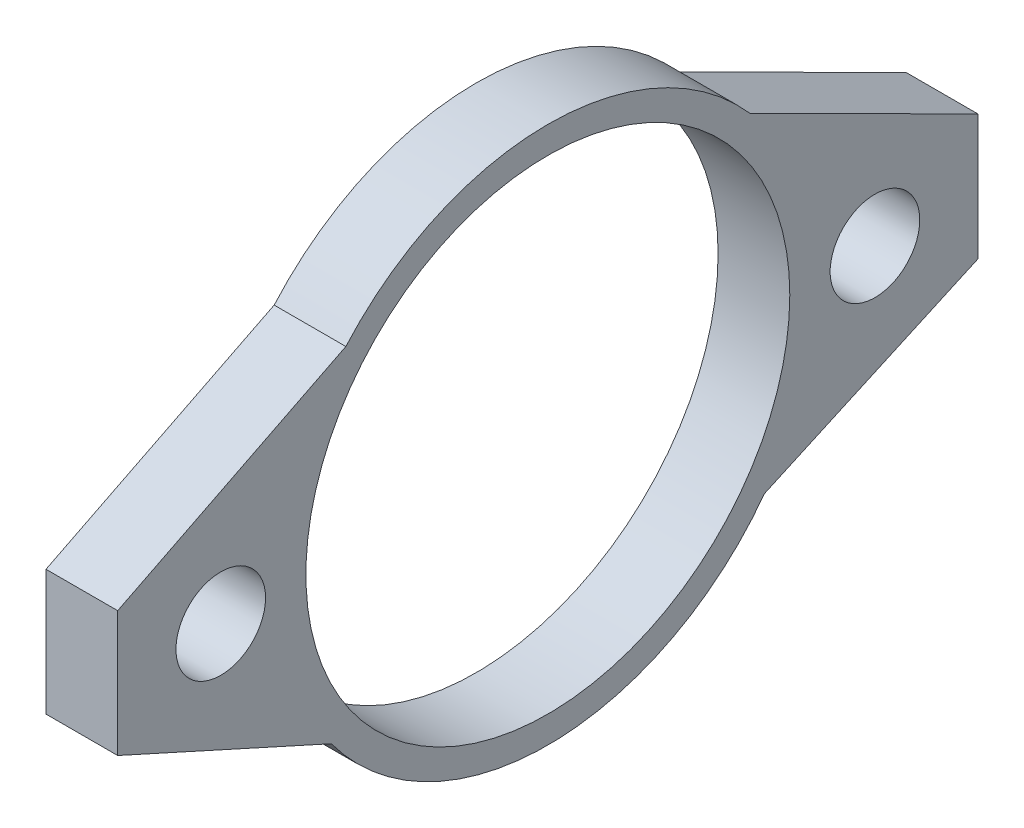
ISO-10303-21;
HEADER;
FILE_DESCRIPTION(('STEP AP214'),'2;1');
FILE_NAME('part.step','',(''),(''),'','','');
FILE_SCHEMA(('AUTOMOTIVE_DESIGN { 1 0 10303 214 1 1 1 1 }'));
ENDSEC;
DATA;
#1=APPLICATION_CONTEXT('core data for automotive mechanical design processes');
#2=APPLICATION_PROTOCOL_DEFINITION('international standard','automotive_design',2000,#1);
#3=PRODUCT_CONTEXT('',#1,'mechanical');
#4=PRODUCT('Part','Part','',(#3));
#5=PRODUCT_RELATED_PRODUCT_CATEGORY('part','',(#4));
#6=PRODUCT_DEFINITION_FORMATION('','',#4);
#7=PRODUCT_DEFINITION_CONTEXT('part definition',#1,'design');
#8=PRODUCT_DEFINITION('design','',#6,#7);
#9=PRODUCT_DEFINITION_SHAPE('','',#8);
#10=(LENGTH_UNIT() NAMED_UNIT(*) SI_UNIT(.MILLI.,.METRE.));
#11=(NAMED_UNIT(*) PLANE_ANGLE_UNIT() SI_UNIT($,.RADIAN.));
#12=(NAMED_UNIT(*) SI_UNIT($,.STERADIAN.) SOLID_ANGLE_UNIT());
#13=UNCERTAINTY_MEASURE_WITH_UNIT(LENGTH_MEASURE(1.E-05),#10,'distance_accuracy_value','');
#14=(GEOMETRIC_REPRESENTATION_CONTEXT(3) GLOBAL_UNCERTAINTY_ASSIGNED_CONTEXT((#13)) GLOBAL_UNIT_ASSIGNED_CONTEXT((#10,
#11,#12)) REPRESENTATION_CONTEXT('',''));
#15=CARTESIAN_POINT('',(0.,0.,0.));
#16=DIRECTION('',(0.,0.,1.));
#17=DIRECTION('',(1.,0.,0.));
#18=AXIS2_PLACEMENT_3D('',#15,#16,#17);
#19=CARTESIAN_POINT('',(4.,0.,0.));
#20=DIRECTION('',(1.,0.,0.));
#21=DIRECTION('',(0.,0.,-1.));
#22=AXIS2_PLACEMENT_3D('',#19,#20,#21);
#23=PLANE('',#22);
#24=CARTESIAN_POINT('',(4.,0.,-18.25));
#25=DIRECTION('',(1.,0.,0.));
#26=DIRECTION('',(0.,0.,-1.));
#27=AXIS2_PLACEMENT_3D('',#24,#25,#26);
#28=CIRCLE('',#27,2.5);
#29=CARTESIAN_POINT('',(4.,0.,-20.75));
#30=VERTEX_POINT('',#29);
#31=EDGE_CURVE('E182',#30,#30,#28,.T.);
#32=ORIENTED_EDGE('',*,*,#31,.F.);
#33=EDGE_LOOP('',(#32));
#34=FACE_BOUND('',#33,.T.);
#35=CARTESIAN_POINT('',(4.,0.,0.));
#36=DIRECTION('',(1.,0.,0.));
#37=DIRECTION('',(0.,0.,-1.));
#38=AXIS2_PLACEMENT_3D('',#35,#36,#37);
#39=CIRCLE('',#38,15.);
#40=CARTESIAN_POINT('',(4.,9.89913327459769,-11.2697453570058));
#41=VERTEX_POINT('',#40);
#42=CARTESIAN_POINT('',(4.,9.89913327459768,11.2697453570058));
#43=VERTEX_POINT('',#42);
#44=EDGE_CURVE('E145',#41,#43,#39,.T.);
#45=ORIENTED_EDGE('',*,*,#44,.T.);
#46=DIRECTION('',(0.,-0.449121937525808,0.893470472502065));
#47=VECTOR('',#46,1.);
#48=CARTESIAN_POINT('',(4.,3.49999999999999,24.));
#49=LINE('',#48,#47);
#50=CARTESIAN_POINT('',(4.,3.49999999999999,24.));
#51=VERTEX_POINT('',#50);
#52=EDGE_CURVE('E93',#43,#51,#49,.T.);
#53=ORIENTED_EDGE('',*,*,#52,.T.);
#54=DIRECTION('',(0.,-1.,0.));
#55=VECTOR('',#54,1.);
#56=CARTESIAN_POINT('',(4.,3.49999999999999,24.));
#57=LINE('',#56,#55);
#58=CARTESIAN_POINT('',(4.,-3.50000000000001,24.));
#59=VERTEX_POINT('',#58);
#60=EDGE_CURVE('E160',#51,#59,#57,.T.);
#61=ORIENTED_EDGE('',*,*,#60,.T.);
#62=DIRECTION('',(0.,-0.41207050339692,-0.911151963302615));
#63=VECTOR('',#62,1.);
#64=CARTESIAN_POINT('',(4.,-3.50000000000001,24.));
#65=LINE('',#64,#63);
#66=CARTESIAN_POINT('',(4.,-8.89010453167822,12.081640675663));
#67=VERTEX_POINT('',#66);
#68=EDGE_CURVE('E173',#59,#67,#65,.T.);
#69=ORIENTED_EDGE('',*,*,#68,.T.);
#70=CARTESIAN_POINT('',(4.,0.,0.));
#71=DIRECTION('',(1.,0.,0.));
#72=DIRECTION('',(0.,0.,-1.));
#73=AXIS2_PLACEMENT_3D('',#70,#71,#72);
#74=CIRCLE('',#73,15.);
#75=CARTESIAN_POINT('',(4.,-8.89010453167822,-12.081640675663));
#76=VERTEX_POINT('',#75);
#77=EDGE_CURVE('E112',#67,#76,#74,.T.);
#78=ORIENTED_EDGE('',*,*,#77,.T.);
#79=DIRECTION('',(0.,0.41207050339692,-0.911151963302614));
#80=VECTOR('',#79,1.);
#81=CARTESIAN_POINT('',(4.,-8.89010453167822,-12.081640675663));
#82=LINE('',#81,#80);
#83=CARTESIAN_POINT('',(4.,-3.5,-24.));
#84=VERTEX_POINT('',#83);
#85=EDGE_CURVE('E106',#76,#84,#82,.T.);
#86=ORIENTED_EDGE('',*,*,#85,.T.);
#87=DIRECTION('',(0.,1.,0.));
#88=VECTOR('',#87,1.);
#89=CARTESIAN_POINT('',(4.,3.5,-24.));
#90=LINE('',#89,#88);
#91=CARTESIAN_POINT('',(4.,3.5,-24.));
#92=VERTEX_POINT('',#91);
#93=EDGE_CURVE('E110',#84,#92,#90,.T.);
#94=ORIENTED_EDGE('',*,*,#93,.T.);
#95=DIRECTION('',(0.,0.449121937525808,0.893470472502065));
#96=VECTOR('',#95,1.);
#97=CARTESIAN_POINT('',(4.,9.89913327459769,-11.2697453570058));
#98=LINE('',#97,#96);
#99=EDGE_CURVE('E50',#92,#41,#98,.T.);
#100=ORIENTED_EDGE('',*,*,#99,.T.);
#101=EDGE_LOOP('',(#45,#53,#61,#69,#78,#86,#94,#100));
#102=FACE_BOUND('',#101,.T.);
#103=CARTESIAN_POINT('',(4.,0.,18.25));
#104=DIRECTION('',(1.,0.,0.));
#105=DIRECTION('',(0.,0.,-1.));
#106=AXIS2_PLACEMENT_3D('',#103,#104,#105);
#107=CIRCLE('',#106,2.5);
#108=CARTESIAN_POINT('',(4.,0.,15.75));
#109=VERTEX_POINT('',#108);
#110=EDGE_CURVE('E134',#109,#109,#107,.T.);
#111=ORIENTED_EDGE('',*,*,#110,.F.);
#112=EDGE_LOOP('',(#111));
#113=FACE_BOUND('',#112,.T.);
#114=CARTESIAN_POINT('',(4.,0.,0.));
#115=DIRECTION('',(1.,0.,0.));
#116=DIRECTION('',(0.,0.,-1.));
#117=AXIS2_PLACEMENT_3D('',#114,#115,#116);
#118=CIRCLE('',#117,13.5);
#119=CARTESIAN_POINT('',(4.,0.,-13.5));
#120=VERTEX_POINT('',#119);
#121=EDGE_CURVE('E188',#120,#120,#118,.T.);
#122=ORIENTED_EDGE('',*,*,#121,.F.);
#123=EDGE_LOOP('',(#122));
#124=FACE_BOUND('',#123,.T.);
#125=ADVANCED_FACE('F33',(#34,#102,#113,#124),#23,.T.);
#126=CARTESIAN_POINT('',(0.,0.,0.));
#127=DIRECTION('',(1.,0.,0.));
#128=DIRECTION('',(0.,0.,-1.));
#129=AXIS2_PLACEMENT_3D('',#126,#127,#128);
#130=PLANE('',#129);
#131=CARTESIAN_POINT('',(0.,0.,-18.25));
#132=DIRECTION('',(1.,0.,0.));
#133=DIRECTION('',(0.,0.,-1.));
#134=AXIS2_PLACEMENT_3D('',#131,#132,#133);
#135=CIRCLE('',#134,2.5);
#136=CARTESIAN_POINT('',(0.,0.,-20.75));
#137=VERTEX_POINT('',#136);
#138=EDGE_CURVE('E185',#137,#137,#135,.T.);
#139=ORIENTED_EDGE('',*,*,#138,.T.);
#140=EDGE_LOOP('',(#139));
#141=FACE_BOUND('',#140,.T.);
#142=CARTESIAN_POINT('',(0.,0.,0.));
#143=DIRECTION('',(1.,0.,0.));
#144=DIRECTION('',(0.,0.,-1.));
#145=AXIS2_PLACEMENT_3D('',#142,#143,#144);
#146=CIRCLE('',#145,15.);
#147=CARTESIAN_POINT('',(0.,9.89913327459769,-11.2697453570058));
#148=VERTEX_POINT('',#147);
#149=CARTESIAN_POINT('',(0.,9.89913327459768,11.2697453570058));
#150=VERTEX_POINT('',#149);
#151=EDGE_CURVE('E130',#148,#150,#146,.T.);
#152=ORIENTED_EDGE('',*,*,#151,.F.);
#153=DIRECTION('',(0.,0.449121937525808,0.893470472502065));
#154=VECTOR('',#153,1.);
#155=CARTESIAN_POINT('',(0.,9.89913327459769,-11.2697453570058));
#156=LINE('',#155,#154);
#157=CARTESIAN_POINT('',(0.,3.5,-24.));
#158=VERTEX_POINT('',#157);
#159=EDGE_CURVE('E85',#158,#148,#156,.T.);
#160=ORIENTED_EDGE('',*,*,#159,.F.);
#161=DIRECTION('',(0.,1.,0.));
#162=VECTOR('',#161,1.);
#163=CARTESIAN_POINT('',(0.,3.5,-24.));
#164=LINE('',#163,#162);
#165=CARTESIAN_POINT('',(0.,-3.5,-24.));
#166=VERTEX_POINT('',#165);
#167=EDGE_CURVE('E79',#166,#158,#164,.T.);
#168=ORIENTED_EDGE('',*,*,#167,.F.);
#169=DIRECTION('',(0.,0.41207050339692,-0.911151963302614));
#170=VECTOR('',#169,1.);
#171=CARTESIAN_POINT('',(0.,-8.89010453167822,-12.081640675663));
#172=LINE('',#171,#170);
#173=CARTESIAN_POINT('',(0.,-8.89010453167822,-12.081640675663));
#174=VERTEX_POINT('',#173);
#175=EDGE_CURVE('E120',#174,#166,#172,.T.);
#176=ORIENTED_EDGE('',*,*,#175,.F.);
#177=CARTESIAN_POINT('',(0.,0.,0.));
#178=DIRECTION('',(1.,0.,0.));
#179=DIRECTION('',(0.,0.,-1.));
#180=AXIS2_PLACEMENT_3D('',#177,#178,#179);
#181=CIRCLE('',#180,15.);
#182=CARTESIAN_POINT('',(0.,-8.89010453167822,12.081640675663));
#183=VERTEX_POINT('',#182);
#184=EDGE_CURVE('E140',#183,#174,#181,.T.);
#185=ORIENTED_EDGE('',*,*,#184,.F.);
#186=DIRECTION('',(0.,-0.41207050339692,-0.911151963302615));
#187=VECTOR('',#186,1.);
#188=CARTESIAN_POINT('',(0.,-3.50000000000001,24.));
#189=LINE('',#188,#187);
#190=CARTESIAN_POINT('',(0.,-3.50000000000001,24.));
#191=VERTEX_POINT('',#190);
#192=EDGE_CURVE('E138',#191,#183,#189,.T.);
#193=ORIENTED_EDGE('',*,*,#192,.F.);
#194=DIRECTION('',(0.,-1.,0.));
#195=VECTOR('',#194,1.);
#196=CARTESIAN_POINT('',(0.,3.49999999999999,24.));
#197=LINE('',#196,#195);
#198=CARTESIAN_POINT('',(0.,3.49999999999999,24.));
#199=VERTEX_POINT('',#198);
#200=EDGE_CURVE('E136',#199,#191,#197,.T.);
#201=ORIENTED_EDGE('',*,*,#200,.F.);
#202=DIRECTION('',(0.,-0.449121937525808,0.893470472502065));
#203=VECTOR('',#202,1.);
#204=CARTESIAN_POINT('',(0.,3.49999999999999,24.));
#205=LINE('',#204,#203);
#206=EDGE_CURVE('E133',#150,#199,#205,.T.);
#207=ORIENTED_EDGE('',*,*,#206,.F.);
#208=EDGE_LOOP('',(#152,#160,#168,#176,#185,#193,#201,#207));
#209=FACE_BOUND('',#208,.T.);
#210=CARTESIAN_POINT('',(0.,0.,18.25));
#211=DIRECTION('',(1.,0.,0.));
#212=DIRECTION('',(0.,0.,-1.));
#213=AXIS2_PLACEMENT_3D('',#210,#211,#212);
#214=CIRCLE('',#213,2.5);
#215=CARTESIAN_POINT('',(0.,0.,15.75));
#216=VERTEX_POINT('',#215);
#217=EDGE_CURVE('E179',#216,#216,#214,.T.);
#218=ORIENTED_EDGE('',*,*,#217,.T.);
#219=EDGE_LOOP('',(#218));
#220=FACE_BOUND('',#219,.T.);
#221=CARTESIAN_POINT('',(0.,0.,0.));
#222=DIRECTION('',(1.,0.,0.));
#223=DIRECTION('',(0.,0.,-1.));
#224=AXIS2_PLACEMENT_3D('',#221,#222,#223);
#225=CIRCLE('',#224,13.5);
#226=CARTESIAN_POINT('',(0.,0.,-13.5));
#227=VERTEX_POINT('',#226);
#228=EDGE_CURVE('E191',#227,#227,#225,.T.);
#229=ORIENTED_EDGE('',*,*,#228,.T.);
#230=EDGE_LOOP('',(#229));
#231=FACE_BOUND('',#230,.T.);
#232=ADVANCED_FACE('F164',(#141,#209,#220,#231),#130,.F.);
#233=CARTESIAN_POINT('',(4.,0.,0.));
#234=DIRECTION('',(-1.,0.,0.));
#235=DIRECTION('',(0.,0.,1.));
#236=AXIS2_PLACEMENT_3D('',#233,#234,#235);
#237=CYLINDRICAL_SURFACE('',#236,15.);
#238=ORIENTED_EDGE('',*,*,#151,.T.);
#239=DIRECTION('',(-1.,0.,0.));
#240=VECTOR('',#239,1.);
#241=CARTESIAN_POINT('',(4.,9.89913327459768,11.2697453570058));
#242=LINE('',#241,#240);
#243=EDGE_CURVE('E11',#43,#150,#242,.T.);
#244=ORIENTED_EDGE('',*,*,#243,.F.);
#245=ORIENTED_EDGE('',*,*,#44,.F.);
#246=DIRECTION('',(-1.,0.,0.));
#247=VECTOR('',#246,1.);
#248=CARTESIAN_POINT('',(4.,9.89913327459769,-11.2697453570058));
#249=LINE('',#248,#247);
#250=EDGE_CURVE('E126',#41,#148,#249,.T.);
#251=ORIENTED_EDGE('',*,*,#250,.T.);
#252=EDGE_LOOP('',(#238,#244,#245,#251));
#253=FACE_BOUND('',#252,.T.);
#254=ADVANCED_FACE('F35',(#253),#237,.T.);
#255=CARTESIAN_POINT('',(4.,3.49999999999999,24.));
#256=DIRECTION('',(0.,-0.893470472502066,-0.449121937525808));
#257=DIRECTION('',(0.,0.449121937525808,-0.893470472502066));
#258=AXIS2_PLACEMENT_3D('',#255,#256,#257);
#259=PLANE('',#258);
#260=ORIENTED_EDGE('',*,*,#206,.T.);
#261=DIRECTION('',(-1.,0.,0.));
#262=VECTOR('',#261,1.);
#263=CARTESIAN_POINT('',(4.,3.49999999999999,24.));
#264=LINE('',#263,#262);
#265=EDGE_CURVE('E42',#51,#199,#264,.T.);
#266=ORIENTED_EDGE('',*,*,#265,.F.);
#267=ORIENTED_EDGE('',*,*,#52,.F.);
#268=ORIENTED_EDGE('',*,*,#243,.T.);
#269=EDGE_LOOP('',(#260,#266,#267,#268));
#270=FACE_BOUND('',#269,.T.);
#271=ADVANCED_FACE('F225',(#270),#259,.F.);
#272=CARTESIAN_POINT('',(4.,3.49999999999999,24.));
#273=DIRECTION('',(0.,0.,-1.));
#274=DIRECTION('',(-1.,0.,0.));
#275=AXIS2_PLACEMENT_3D('',#272,#273,#274);
#276=PLANE('',#275);
#277=ORIENTED_EDGE('',*,*,#200,.T.);
#278=DIRECTION('',(-1.,0.,0.));
#279=VECTOR('',#278,1.);
#280=CARTESIAN_POINT('',(4.,-3.50000000000001,24.));
#281=LINE('',#280,#279);
#282=EDGE_CURVE('E152',#59,#191,#281,.T.);
#283=ORIENTED_EDGE('',*,*,#282,.F.);
#284=ORIENTED_EDGE('',*,*,#60,.F.);
#285=ORIENTED_EDGE('',*,*,#265,.T.);
#286=EDGE_LOOP('',(#277,#283,#284,#285));
#287=FACE_BOUND('',#286,.T.);
#288=ADVANCED_FACE('F158',(#287),#276,.F.);
#289=CARTESIAN_POINT('',(4.,-3.50000000000001,24.));
#290=DIRECTION('',(0.,0.911151963302615,-0.41207050339692));
#291=DIRECTION('',(0.,0.41207050339692,0.911151963302615));
#292=AXIS2_PLACEMENT_3D('',#289,#290,#291);
#293=PLANE('',#292);
#294=ORIENTED_EDGE('',*,*,#192,.T.);
#295=DIRECTION('',(-1.,0.,0.));
#296=VECTOR('',#295,1.);
#297=CARTESIAN_POINT('',(4.,-8.89010453167822,12.081640675663));
#298=LINE('',#297,#296);
#299=EDGE_CURVE('E149',#67,#183,#298,.T.);
#300=ORIENTED_EDGE('',*,*,#299,.F.);
#301=ORIENTED_EDGE('',*,*,#68,.F.);
#302=ORIENTED_EDGE('',*,*,#282,.T.);
#303=EDGE_LOOP('',(#294,#300,#301,#302));
#304=FACE_BOUND('',#303,.T.);
#305=ADVANCED_FACE('F169',(#304),#293,.F.);
#306=CARTESIAN_POINT('',(4.,0.,0.));
#307=DIRECTION('',(-1.,0.,0.));
#308=DIRECTION('',(0.,0.,1.));
#309=AXIS2_PLACEMENT_3D('',#306,#307,#308);
#310=CYLINDRICAL_SURFACE('',#309,15.);
#311=ORIENTED_EDGE('',*,*,#184,.T.);
#312=DIRECTION('',(-1.,0.,0.));
#313=VECTOR('',#312,1.);
#314=CARTESIAN_POINT('',(4.,-8.89010453167822,-12.081640675663));
#315=LINE('',#314,#313);
#316=EDGE_CURVE('E121',#76,#174,#315,.T.);
#317=ORIENTED_EDGE('',*,*,#316,.F.);
#318=ORIENTED_EDGE('',*,*,#77,.F.);
#319=ORIENTED_EDGE('',*,*,#299,.T.);
#320=EDGE_LOOP('',(#311,#317,#318,#319));
#321=FACE_BOUND('',#320,.T.);
#322=ADVANCED_FACE('F172',(#321),#310,.T.);
#323=CARTESIAN_POINT('',(4.,-8.89010453167822,-12.081640675663));
#324=DIRECTION('',(0.,0.911151963302614,0.41207050339692));
#325=DIRECTION('',(0.,-0.41207050339692,0.911151963302614));
#326=AXIS2_PLACEMENT_3D('',#323,#324,#325);
#327=PLANE('',#326);
#328=ORIENTED_EDGE('',*,*,#175,.T.);
#329=DIRECTION('',(-1.,0.,0.));
#330=VECTOR('',#329,1.);
#331=CARTESIAN_POINT('',(4.,-3.5,-24.));
#332=LINE('',#331,#330);
#333=EDGE_CURVE('E117',#84,#166,#332,.T.);
#334=ORIENTED_EDGE('',*,*,#333,.F.);
#335=ORIENTED_EDGE('',*,*,#85,.F.);
#336=ORIENTED_EDGE('',*,*,#316,.T.);
#337=EDGE_LOOP('',(#328,#334,#335,#336));
#338=FACE_BOUND('',#337,.T.);
#339=ADVANCED_FACE('F118',(#338),#327,.F.);
#340=CARTESIAN_POINT('',(4.,3.5,-24.));
#341=DIRECTION('',(0.,0.,1.));
#342=DIRECTION('',(1.,0.,0.));
#343=AXIS2_PLACEMENT_3D('',#340,#341,#342);
#344=PLANE('',#343);
#345=ORIENTED_EDGE('',*,*,#167,.T.);
#346=DIRECTION('',(-1.,0.,0.));
#347=VECTOR('',#346,1.);
#348=CARTESIAN_POINT('',(4.,3.5,-24.));
#349=LINE('',#348,#347);
#350=EDGE_CURVE('E122',#92,#158,#349,.T.);
#351=ORIENTED_EDGE('',*,*,#350,.F.);
#352=ORIENTED_EDGE('',*,*,#93,.F.);
#353=ORIENTED_EDGE('',*,*,#333,.T.);
#354=EDGE_LOOP('',(#345,#351,#352,#353));
#355=FACE_BOUND('',#354,.T.);
#356=ADVANCED_FACE('F124',(#355),#344,.F.);
#357=CARTESIAN_POINT('',(4.,9.89913327459769,-11.2697453570058));
#358=DIRECTION('',(0.,-0.893470472502066,0.449121937525808));
#359=DIRECTION('',(0.,-0.449121937525808,-0.893470472502066));
#360=AXIS2_PLACEMENT_3D('',#357,#358,#359);
#361=PLANE('',#360);
#362=ORIENTED_EDGE('',*,*,#159,.T.);
#363=ORIENTED_EDGE('',*,*,#250,.F.);
#364=ORIENTED_EDGE('',*,*,#99,.F.);
#365=ORIENTED_EDGE('',*,*,#350,.T.);
#366=EDGE_LOOP('',(#362,#363,#364,#365));
#367=FACE_BOUND('',#366,.T.);
#368=ADVANCED_FACE('F213',(#367),#361,.F.);
#369=CARTESIAN_POINT('',(4.,0.,18.25));
#370=DIRECTION('',(-1.,0.,0.));
#371=DIRECTION('',(0.,0.,1.));
#372=AXIS2_PLACEMENT_3D('',#369,#370,#371);
#373=CYLINDRICAL_SURFACE('',#372,2.5);
#374=ORIENTED_EDGE('',*,*,#110,.T.);
#375=EDGE_LOOP('',(#374));
#376=FACE_BOUND('',#375,.T.);
#377=ORIENTED_EDGE('',*,*,#217,.F.);
#378=EDGE_LOOP('',(#377));
#379=FACE_BOUND('',#378,.T.);
#380=ADVANCED_FACE('F210',(#376,#379),#373,.F.);
#381=CARTESIAN_POINT('',(4.,0.,-18.25));
#382=DIRECTION('',(-1.,0.,0.));
#383=DIRECTION('',(0.,0.,1.));
#384=AXIS2_PLACEMENT_3D('',#381,#382,#383);
#385=CYLINDRICAL_SURFACE('',#384,2.5);
#386=ORIENTED_EDGE('',*,*,#31,.T.);
#387=EDGE_LOOP('',(#386));
#388=FACE_BOUND('',#387,.T.);
#389=ORIENTED_EDGE('',*,*,#138,.F.);
#390=EDGE_LOOP('',(#389));
#391=FACE_BOUND('',#390,.T.);
#392=ADVANCED_FACE('F289',(#388,#391),#385,.F.);
#393=CARTESIAN_POINT('',(4.,0.,0.));
#394=DIRECTION('',(-1.,0.,0.));
#395=DIRECTION('',(0.,0.,1.));
#396=AXIS2_PLACEMENT_3D('',#393,#394,#395);
#397=CYLINDRICAL_SURFACE('',#396,13.5);
#398=ORIENTED_EDGE('',*,*,#121,.T.);
#399=EDGE_LOOP('',(#398));
#400=FACE_BOUND('',#399,.T.);
#401=ORIENTED_EDGE('',*,*,#228,.F.);
#402=EDGE_LOOP('',(#401));
#403=FACE_BOUND('',#402,.T.);
#404=ADVANCED_FACE('F197',(#400,#403),#397,.F.);
#405=CLOSED_SHELL('',(#125,#232,#254,#271,#288,#305,#322,#339,#356,#368,#380,#392,#404));
#406=MANIFOLD_SOLID_BREP('B2',#405);
#407=ADVANCED_BREP_SHAPE_REPRESENTATION('',(#18,#406),#14);
#408=SHAPE_DEFINITION_REPRESENTATION(#9,#407);
ENDSEC;
END-ISO-10303-21;
